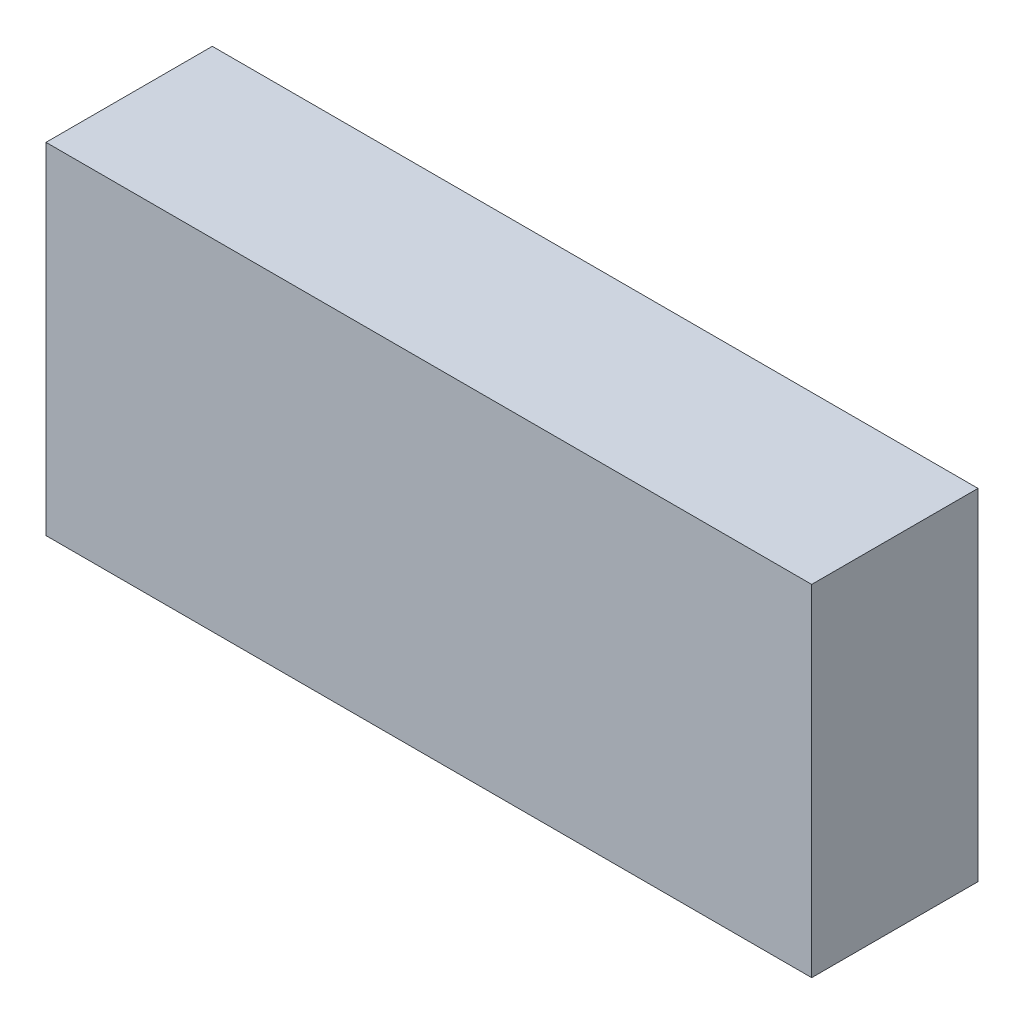
ISO-10303-21;
HEADER;
FILE_DESCRIPTION(('STEP AP214'),'2;1');
FILE_NAME('part.step','',(''),(''),'','','');
FILE_SCHEMA(('AUTOMOTIVE_DESIGN { 1 0 10303 214 1 1 1 1 }'));
ENDSEC;
DATA;
#1=APPLICATION_CONTEXT('core data for automotive mechanical design processes');
#2=APPLICATION_PROTOCOL_DEFINITION('international standard','automotive_design',2000,#1);
#3=PRODUCT_CONTEXT('',#1,'mechanical');
#4=PRODUCT('Part','Part','',(#3));
#5=PRODUCT_RELATED_PRODUCT_CATEGORY('part','',(#4));
#6=PRODUCT_DEFINITION_FORMATION('','',#4);
#7=PRODUCT_DEFINITION_CONTEXT('part definition',#1,'design');
#8=PRODUCT_DEFINITION('design','',#6,#7);
#9=PRODUCT_DEFINITION_SHAPE('','',#8);
#10=(LENGTH_UNIT() NAMED_UNIT(*) SI_UNIT(.MILLI.,.METRE.));
#11=(NAMED_UNIT(*) PLANE_ANGLE_UNIT() SI_UNIT($,.RADIAN.));
#12=(NAMED_UNIT(*) SI_UNIT($,.STERADIAN.) SOLID_ANGLE_UNIT());
#13=UNCERTAINTY_MEASURE_WITH_UNIT(LENGTH_MEASURE(1.E-05),#10,'distance_accuracy_value','');
#14=(GEOMETRIC_REPRESENTATION_CONTEXT(3) GLOBAL_UNCERTAINTY_ASSIGNED_CONTEXT((#13)) GLOBAL_UNIT_ASSIGNED_CONTEXT((#10,
#11,#12)) REPRESENTATION_CONTEXT('',''));
#15=CARTESIAN_POINT('',(0.,0.,0.));
#16=DIRECTION('',(0.,0.,1.));
#17=DIRECTION('',(1.,0.,0.));
#18=AXIS2_PLACEMENT_3D('',#15,#16,#17);
#19=CARTESIAN_POINT('',(-1.7302,-3.5524,0.1));
#20=DIRECTION('',(0.,0.,1.));
#21=DIRECTION('',(1.,0.,0.));
#22=AXIS2_PLACEMENT_3D('',#19,#20,#21);
#23=PLANE('',#22);
#24=DIRECTION('',(1.,0.,0.));
#25=VECTOR('',#24,1.);
#26=CARTESIAN_POINT('',(-1.7302,-3.3476,0.1));
#27=LINE('',#26,#25);
#28=CARTESIAN_POINT('',(-1.7302,-3.3476,0.1));
#29=VERTEX_POINT('',#28);
#30=CARTESIAN_POINT('',(-1.2698,-3.3476,0.1));
#31=VERTEX_POINT('',#30);
#32=EDGE_CURVE('E53',#29,#31,#27,.T.);
#33=ORIENTED_EDGE('',*,*,#32,.F.);
#34=DIRECTION('',(0.,1.,0.));
#35=VECTOR('',#34,1.);
#36=CARTESIAN_POINT('',(-1.7302,-3.5524,0.1));
#37=LINE('',#36,#35);
#38=CARTESIAN_POINT('',(-1.7302,-3.5524,0.1));
#39=VERTEX_POINT('',#38);
#40=EDGE_CURVE('E68',#39,#29,#37,.T.);
#41=ORIENTED_EDGE('',*,*,#40,.F.);
#42=DIRECTION('',(1.,0.,0.));
#43=VECTOR('',#42,1.);
#44=CARTESIAN_POINT('',(-1.2698,-3.5524,0.1));
#45=LINE('',#44,#43);
#46=CARTESIAN_POINT('',(-1.2698,-3.5524,0.1));
#47=VERTEX_POINT('',#46);
#48=EDGE_CURVE('E20',#47,#39,#45,.F.);
#49=ORIENTED_EDGE('',*,*,#48,.F.);
#50=DIRECTION('',(0.,1.,0.));
#51=VECTOR('',#50,1.);
#52=CARTESIAN_POINT('',(-1.2698,-3.3476,0.1));
#53=LINE('',#52,#51);
#54=EDGE_CURVE('E58',#31,#47,#53,.F.);
#55=ORIENTED_EDGE('',*,*,#54,.F.);
#56=EDGE_LOOP('',(#33,#41,#49,#55));
#57=FACE_BOUND('',#56,.T.);
#58=ADVANCED_FACE('F17',(#57),#23,.T.);
#59=CARTESIAN_POINT('',(-1.2698,-3.5524,0.));
#60=DIRECTION('',(0.,-1.,0.));
#61=DIRECTION('',(0.,0.,-1.));
#62=AXIS2_PLACEMENT_3D('',#59,#60,#61);
#63=PLANE('',#62);
#64=DIRECTION('',(0.,0.,1.));
#65=VECTOR('',#64,1.);
#66=CARTESIAN_POINT('',(-1.7302,-3.5524,0.));
#67=LINE('',#66,#65);
#68=CARTESIAN_POINT('',(-1.7302,-3.5524,0.));
#69=VERTEX_POINT('',#68);
#70=EDGE_CURVE('E79',#69,#39,#67,.T.);
#71=ORIENTED_EDGE('',*,*,#70,.F.);
#72=DIRECTION('',(1.,0.,0.));
#73=VECTOR('',#72,1.);
#74=CARTESIAN_POINT('',(-1.7302,-3.5524,0.));
#75=LINE('',#74,#73);
#76=CARTESIAN_POINT('',(-1.2698,-3.5524,0.));
#77=VERTEX_POINT('',#76);
#78=EDGE_CURVE('E74',#69,#77,#75,.T.);
#79=ORIENTED_EDGE('',*,*,#78,.T.);
#80=DIRECTION('',(0.,0.,-1.));
#81=VECTOR('',#80,1.);
#82=CARTESIAN_POINT('',(-1.2698,-3.5524,0.));
#83=LINE('',#82,#81);
#84=EDGE_CURVE('E63',#47,#77,#83,.T.);
#85=ORIENTED_EDGE('',*,*,#84,.F.);
#86=ORIENTED_EDGE('',*,*,#48,.T.);
#87=EDGE_LOOP('',(#71,#79,#85,#86));
#88=FACE_BOUND('',#87,.T.);
#89=ADVANCED_FACE('F73',(#88),#63,.T.);
#90=CARTESIAN_POINT('',(-1.2698,-3.3476,0.));
#91=DIRECTION('',(1.,0.,0.));
#92=DIRECTION('',(0.,0.,-1.));
#93=AXIS2_PLACEMENT_3D('',#90,#91,#92);
#94=PLANE('',#93);
#95=ORIENTED_EDGE('',*,*,#84,.T.);
#96=DIRECTION('',(0.,1.,0.));
#97=VECTOR('',#96,1.);
#98=CARTESIAN_POINT('',(-1.2698,-3.5524,0.));
#99=LINE('',#98,#97);
#100=CARTESIAN_POINT('',(-1.2698,-3.3476,0.));
#101=VERTEX_POINT('',#100);
#102=EDGE_CURVE('E84',#77,#101,#99,.T.);
#103=ORIENTED_EDGE('',*,*,#102,.T.);
#104=DIRECTION('',(0.,0.,1.));
#105=VECTOR('',#104,1.);
#106=CARTESIAN_POINT('',(-1.2698,-3.3476,0.));
#107=LINE('',#106,#105);
#108=EDGE_CURVE('E65',#31,#101,#107,.F.);
#109=ORIENTED_EDGE('',*,*,#108,.F.);
#110=ORIENTED_EDGE('',*,*,#54,.T.);
#111=EDGE_LOOP('',(#95,#103,#109,#110));
#112=FACE_BOUND('',#111,.T.);
#113=ADVANCED_FACE('F60',(#112),#94,.T.);
#114=CARTESIAN_POINT('',(-1.7302,-3.3476,0.));
#115=DIRECTION('',(0.,1.,0.));
#116=DIRECTION('',(0.,0.,1.));
#117=AXIS2_PLACEMENT_3D('',#114,#115,#116);
#118=PLANE('',#117);
#119=ORIENTED_EDGE('',*,*,#108,.T.);
#120=DIRECTION('',(1.,0.,0.));
#121=VECTOR('',#120,1.);
#122=CARTESIAN_POINT('',(-1.7302,-3.3476,0.));
#123=LINE('',#122,#121);
#124=CARTESIAN_POINT('',(-1.7302,-3.3476,0.));
#125=VERTEX_POINT('',#124);
#126=EDGE_CURVE('E26',#101,#125,#123,.F.);
#127=ORIENTED_EDGE('',*,*,#126,.T.);
#128=DIRECTION('',(0.,0.,1.));
#129=VECTOR('',#128,1.);
#130=CARTESIAN_POINT('',(-1.7302,-3.3476,0.));
#131=LINE('',#130,#129);
#132=EDGE_CURVE('E34',#29,#125,#131,.F.);
#133=ORIENTED_EDGE('',*,*,#132,.F.);
#134=ORIENTED_EDGE('',*,*,#32,.T.);
#135=EDGE_LOOP('',(#119,#127,#133,#134));
#136=FACE_BOUND('',#135,.T.);
#137=ADVANCED_FACE('F88',(#136),#118,.T.);
#138=CARTESIAN_POINT('',(-1.7302,-3.5524,0.));
#139=DIRECTION('',(-1.,0.,0.));
#140=DIRECTION('',(0.,0.,1.));
#141=AXIS2_PLACEMENT_3D('',#138,#139,#140);
#142=PLANE('',#141);
#143=ORIENTED_EDGE('',*,*,#132,.T.);
#144=DIRECTION('',(0.,1.,0.));
#145=VECTOR('',#144,1.);
#146=CARTESIAN_POINT('',(-1.7302,-3.5524,0.));
#147=LINE('',#146,#145);
#148=EDGE_CURVE('E11',#125,#69,#147,.F.);
#149=ORIENTED_EDGE('',*,*,#148,.T.);
#150=ORIENTED_EDGE('',*,*,#70,.T.);
#151=ORIENTED_EDGE('',*,*,#40,.T.);
#152=EDGE_LOOP('',(#143,#149,#150,#151));
#153=FACE_BOUND('',#152,.T.);
#154=ADVANCED_FACE('F91',(#153),#142,.T.);
#155=CARTESIAN_POINT('',(-1.7302,-3.5524,0.));
#156=DIRECTION('',(0.,0.,1.));
#157=DIRECTION('',(1.,0.,0.));
#158=AXIS2_PLACEMENT_3D('',#155,#156,#157);
#159=PLANE('',#158);
#160=ORIENTED_EDGE('',*,*,#126,.F.);
#161=ORIENTED_EDGE('',*,*,#102,.F.);
#162=ORIENTED_EDGE('',*,*,#78,.F.);
#163=ORIENTED_EDGE('',*,*,#148,.F.);
#164=EDGE_LOOP('',(#160,#161,#162,#163));
#165=FACE_BOUND('',#164,.T.);
#166=ADVANCED_FACE('F90',(#165),#159,.F.);
#167=CLOSED_SHELL('',(#58,#89,#113,#137,#154,#166));
#168=MANIFOLD_SOLID_BREP('B1',#167);
#169=ADVANCED_BREP_SHAPE_REPRESENTATION('',(#18,#168),#14);
#170=SHAPE_DEFINITION_REPRESENTATION(#9,#169);
ENDSEC;
END-ISO-10303-21;
